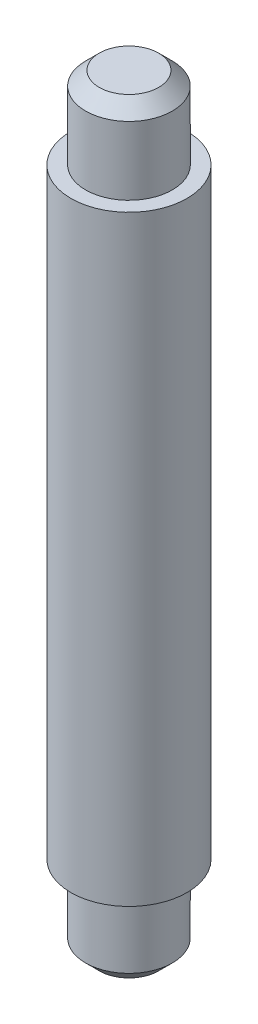
ISO-10303-21;
HEADER;
FILE_DESCRIPTION(('STEP AP214'),'2;1');
FILE_NAME('part.step','',(''),(''),'','','');
FILE_SCHEMA(('AUTOMOTIVE_DESIGN { 1 0 10303 214 1 1 1 1 }'));
ENDSEC;
DATA;
#1=APPLICATION_CONTEXT('core data for automotive mechanical design processes');
#2=APPLICATION_PROTOCOL_DEFINITION('international standard','automotive_design',2000,#1);
#3=PRODUCT_CONTEXT('',#1,'mechanical');
#4=PRODUCT('Part','Part','',(#3));
#5=PRODUCT_RELATED_PRODUCT_CATEGORY('part','',(#4));
#6=PRODUCT_DEFINITION_FORMATION('','',#4);
#7=PRODUCT_DEFINITION_CONTEXT('part definition',#1,'design');
#8=PRODUCT_DEFINITION('design','',#6,#7);
#9=PRODUCT_DEFINITION_SHAPE('','',#8);
#10=(LENGTH_UNIT() NAMED_UNIT(*) SI_UNIT(.MILLI.,.METRE.));
#11=(NAMED_UNIT(*) PLANE_ANGLE_UNIT() SI_UNIT($,.RADIAN.));
#12=(NAMED_UNIT(*) SI_UNIT($,.STERADIAN.) SOLID_ANGLE_UNIT());
#13=UNCERTAINTY_MEASURE_WITH_UNIT(LENGTH_MEASURE(1.E-05),#10,'distance_accuracy_value','');
#14=(GEOMETRIC_REPRESENTATION_CONTEXT(3) GLOBAL_UNCERTAINTY_ASSIGNED_CONTEXT((#13)) GLOBAL_UNIT_ASSIGNED_CONTEXT((#10,
#11,#12)) REPRESENTATION_CONTEXT('',''));
#15=CARTESIAN_POINT('',(0.,0.,0.));
#16=DIRECTION('',(0.,0.,1.));
#17=DIRECTION('',(1.,0.,0.));
#18=AXIS2_PLACEMENT_3D('',#15,#16,#17);
#19=CARTESIAN_POINT('',(0.,44.,0.));
#20=DIRECTION('',(0.,-1.,0.));
#21=DIRECTION('',(0.,0.,-1.));
#22=AXIS2_PLACEMENT_3D('',#19,#20,#21);
#23=CYLINDRICAL_SURFACE('',#22,4.25);
#24=CARTESIAN_POINT('',(0.,44.,0.));
#25=DIRECTION('',(0.,1.,0.));
#26=DIRECTION('',(0.,0.,1.));
#27=AXIS2_PLACEMENT_3D('',#24,#25,#26);
#28=CIRCLE('',#27,4.25);
#29=CARTESIAN_POINT('',(0.,44.,4.25));
#30=VERTEX_POINT('',#29);
#31=EDGE_CURVE('E57',#30,#30,#28,.T.);
#32=ORIENTED_EDGE('',*,*,#31,.F.);
#33=EDGE_LOOP('',(#32));
#34=FACE_BOUND('',#33,.T.);
#35=CARTESIAN_POINT('',(0.,0.,0.));
#36=DIRECTION('',(0.,1.,0.));
#37=DIRECTION('',(0.,0.,1.));
#38=AXIS2_PLACEMENT_3D('',#35,#36,#37);
#39=CIRCLE('',#38,4.25);
#40=CARTESIAN_POINT('',(0.,0.,4.25));
#41=VERTEX_POINT('',#40);
#42=EDGE_CURVE('E58',#41,#41,#39,.T.);
#43=ORIENTED_EDGE('',*,*,#42,.T.);
#44=EDGE_LOOP('',(#43));
#45=FACE_BOUND('',#44,.T.);
#46=ADVANCED_FACE('F33',(#34,#45),#23,.T.);
#47=CARTESIAN_POINT('',(0.,44.,0.));
#48=DIRECTION('',(0.,1.,0.));
#49=DIRECTION('',(0.,0.,1.));
#50=AXIS2_PLACEMENT_3D('',#47,#48,#49);
#51=PLANE('',#50);
#52=CARTESIAN_POINT('',(0.,44.,0.));
#53=DIRECTION('',(0.,1.,0.));
#54=DIRECTION('',(0.,0.,1.));
#55=AXIS2_PLACEMENT_3D('',#52,#53,#54);
#56=CIRCLE('',#55,3.175);
#57=CARTESIAN_POINT('',(0.,44.,3.175));
#58=VERTEX_POINT('',#57);
#59=EDGE_CURVE('E61',#58,#58,#56,.F.);
#60=ORIENTED_EDGE('',*,*,#59,.T.);
#61=EDGE_LOOP('',(#60));
#62=FACE_BOUND('',#61,.T.);
#63=ORIENTED_EDGE('',*,*,#31,.T.);
#64=EDGE_LOOP('',(#63));
#65=FACE_BOUND('',#64,.T.);
#66=ADVANCED_FACE('F67',(#62,#65),#51,.T.);
#67=CARTESIAN_POINT('',(0.,0.,0.));
#68=DIRECTION('',(0.,1.,0.));
#69=DIRECTION('',(0.,0.,1.));
#70=AXIS2_PLACEMENT_3D('',#67,#68,#69);
#71=PLANE('',#70);
#72=CARTESIAN_POINT('',(0.,0.,0.));
#73=DIRECTION('',(0.,1.,0.));
#74=DIRECTION('',(0.,0.,1.));
#75=AXIS2_PLACEMENT_3D('',#72,#73,#74);
#76=CIRCLE('',#75,3.175);
#77=CARTESIAN_POINT('',(0.,0.,3.175));
#78=VERTEX_POINT('',#77);
#79=EDGE_CURVE('E54',#78,#78,#76,.F.);
#80=ORIENTED_EDGE('',*,*,#79,.F.);
#81=EDGE_LOOP('',(#80));
#82=FACE_BOUND('',#81,.T.);
#83=ORIENTED_EDGE('',*,*,#42,.F.);
#84=EDGE_LOOP('',(#83));
#85=FACE_BOUND('',#84,.T.);
#86=ADVANCED_FACE('F92',(#82,#85),#71,.F.);
#87=CARTESIAN_POINT('',(0.,-6.,0.));
#88=DIRECTION('',(0.,-1.,0.));
#89=DIRECTION('',(0.,0.,-1.));
#90=AXIS2_PLACEMENT_3D('',#87,#88,#89);
#91=PLANE('',#90);
#92=CARTESIAN_POINT('',(0.,-6.,0.));
#93=DIRECTION('',(0.,-1.,0.));
#94=DIRECTION('',(0.,0.,-1.));
#95=AXIS2_PLACEMENT_3D('',#92,#93,#94);
#96=CIRCLE('',#95,2.175);
#97=CARTESIAN_POINT('',(0.,-6.,-2.175));
#98=VERTEX_POINT('',#97);
#99=EDGE_CURVE('E49',#98,#98,#96,.T.);
#100=ORIENTED_EDGE('',*,*,#99,.T.);
#101=EDGE_LOOP('',(#100));
#102=FACE_BOUND('',#101,.T.);
#103=ADVANCED_FACE('F82',(#102),#91,.T.);
#104=CARTESIAN_POINT('',(0.,-6.,0.));
#105=DIRECTION('',(0.,1.,0.));
#106=DIRECTION('',(0.,0.,1.));
#107=AXIS2_PLACEMENT_3D('',#104,#105,#106);
#108=CYLINDRICAL_SURFACE('',#107,3.175);
#109=CARTESIAN_POINT('',(0.,-4.99999999999999,0.));
#110=DIRECTION('',(0.,-1.,0.));
#111=DIRECTION('',(0.,0.,-1.));
#112=AXIS2_PLACEMENT_3D('',#109,#110,#111);
#113=CIRCLE('',#112,3.175);
#114=CARTESIAN_POINT('',(0.,-4.99999999999999,-3.175));
#115=VERTEX_POINT('',#114);
#116=EDGE_CURVE('E45',#115,#115,#113,.F.);
#117=ORIENTED_EDGE('',*,*,#116,.T.);
#118=EDGE_LOOP('',(#117));
#119=FACE_BOUND('',#118,.T.);
#120=ORIENTED_EDGE('',*,*,#79,.T.);
#121=EDGE_LOOP('',(#120));
#122=FACE_BOUND('',#121,.T.);
#123=ADVANCED_FACE('F73',(#119,#122),#108,.T.);
#124=CARTESIAN_POINT('',(0.,49.,0.));
#125=DIRECTION('',(0.,-1.,0.));
#126=DIRECTION('',(0.,0.,-1.));
#127=AXIS2_PLACEMENT_3D('',#124,#125,#126);
#128=CIRCLE('',#127,3.175);
#129=CARTESIAN_POINT('',(0.,49.,-3.175));
#130=VERTEX_POINT('',#129);
#131=EDGE_CURVE('E41',#130,#130,#128,.T.);
#132=ORIENTED_EDGE('',*,*,#131,.T.);
#133=EDGE_LOOP('',(#132));
#134=FACE_BOUND('',#133,.T.);
#135=ORIENTED_EDGE('',*,*,#59,.F.);
#136=EDGE_LOOP('',(#135));
#137=FACE_BOUND('',#136,.T.);
#138=ADVANCED_FACE('F70',(#134,#137),#108,.T.);
#139=CARTESIAN_POINT('',(0.,50.,0.));
#140=DIRECTION('',(0.,-1.,0.));
#141=DIRECTION('',(0.,0.,-1.));
#142=AXIS2_PLACEMENT_3D('',#139,#140,#141);
#143=PLANE('',#142);
#144=CARTESIAN_POINT('',(0.,50.,0.));
#145=DIRECTION('',(0.,-1.,0.));
#146=DIRECTION('',(0.,0.,-1.));
#147=AXIS2_PLACEMENT_3D('',#144,#145,#146);
#148=CIRCLE('',#147,2.175);
#149=CARTESIAN_POINT('',(0.,50.,-2.175));
#150=VERTEX_POINT('',#149);
#151=EDGE_CURVE('E10',#150,#150,#148,.F.);
#152=ORIENTED_EDGE('',*,*,#151,.T.);
#153=EDGE_LOOP('',(#152));
#154=FACE_BOUND('',#153,.T.);
#155=ADVANCED_FACE('F72',(#154),#143,.F.);
#156=CARTESIAN_POINT('',(0.,-6.,0.));
#157=DIRECTION('',(0.,1.,0.));
#158=DIRECTION('',(0.,0.,1.));
#159=AXIS2_PLACEMENT_3D('',#156,#157,#158);
#160=CONICAL_SURFACE('',#159,2.175,0.785398163397443);
#161=ORIENTED_EDGE('',*,*,#116,.F.);
#162=EDGE_LOOP('',(#161));
#163=FACE_BOUND('',#162,.T.);
#164=ORIENTED_EDGE('',*,*,#99,.F.);
#165=EDGE_LOOP('',(#164));
#166=FACE_BOUND('',#165,.T.);
#167=ADVANCED_FACE('F79',(#163,#166),#160,.T.);
#168=CARTESIAN_POINT('',(0.,49.,0.));
#169=DIRECTION('',(0.,-1.,0.));
#170=DIRECTION('',(0.,0.,-1.));
#171=AXIS2_PLACEMENT_3D('',#168,#169,#170);
#172=CONICAL_SURFACE('',#171,3.175,0.785398163397453);
#173=ORIENTED_EDGE('',*,*,#151,.F.);
#174=EDGE_LOOP('',(#173));
#175=FACE_BOUND('',#174,.T.);
#176=ORIENTED_EDGE('',*,*,#131,.F.);
#177=EDGE_LOOP('',(#176));
#178=FACE_BOUND('',#177,.T.);
#179=ADVANCED_FACE('F36',(#175,#178),#172,.T.);
#180=CLOSED_SHELL('',(#46,#66,#86,#103,#123,#138,#155,#167,#179));
#181=MANIFOLD_SOLID_BREP('B2',#180);
#182=ADVANCED_BREP_SHAPE_REPRESENTATION('',(#18,#181),#14);
#183=SHAPE_DEFINITION_REPRESENTATION(#9,#182);
ENDSEC;
END-ISO-10303-21;
